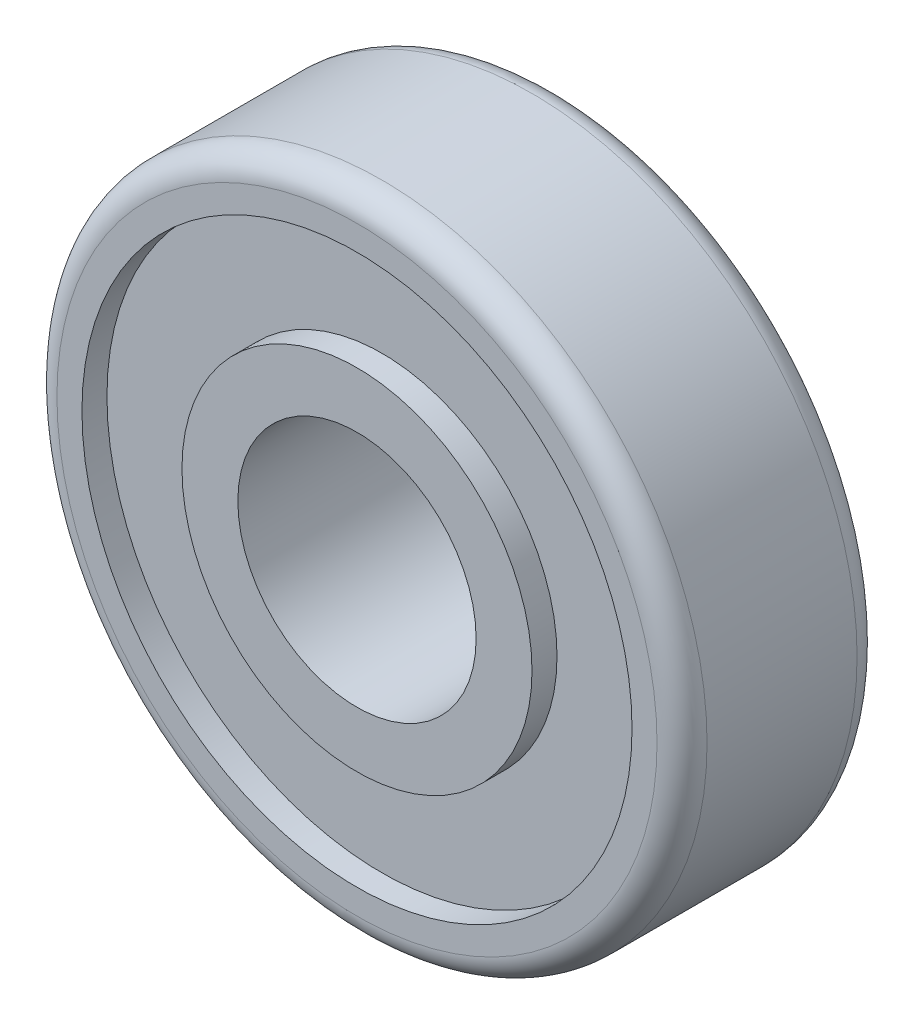
ISO-10303-21;
HEADER;
FILE_DESCRIPTION(('STEP AP214'),'2;1');
FILE_NAME('part.step','',(''),(''),'','','');
FILE_SCHEMA(('AUTOMOTIVE_DESIGN { 1 0 10303 214 1 1 1 1 }'));
ENDSEC;
DATA;
#1=APPLICATION_CONTEXT('core data for automotive mechanical design processes');
#2=APPLICATION_PROTOCOL_DEFINITION('international standard','automotive_design',2000,#1);
#3=PRODUCT_CONTEXT('',#1,'mechanical');
#4=PRODUCT('Part','Part','',(#3));
#5=PRODUCT_RELATED_PRODUCT_CATEGORY('part','',(#4));
#6=PRODUCT_DEFINITION_FORMATION('','',#4);
#7=PRODUCT_DEFINITION_CONTEXT('part definition',#1,'design');
#8=PRODUCT_DEFINITION('design','',#6,#7);
#9=PRODUCT_DEFINITION_SHAPE('','',#8);
#10=(LENGTH_UNIT() NAMED_UNIT(*) SI_UNIT(.MILLI.,.METRE.));
#11=(NAMED_UNIT(*) PLANE_ANGLE_UNIT() SI_UNIT($,.RADIAN.));
#12=(NAMED_UNIT(*) SI_UNIT($,.STERADIAN.) SOLID_ANGLE_UNIT());
#13=UNCERTAINTY_MEASURE_WITH_UNIT(LENGTH_MEASURE(1.E-05),#10,'distance_accuracy_value','');
#14=(GEOMETRIC_REPRESENTATION_CONTEXT(3) GLOBAL_UNCERTAINTY_ASSIGNED_CONTEXT((#13)) GLOBAL_UNIT_ASSIGNED_CONTEXT((#10,
#11,#12)) REPRESENTATION_CONTEXT('',''));
#15=CARTESIAN_POINT('',(0.,0.,0.));
#16=DIRECTION('',(0.,0.,1.));
#17=DIRECTION('',(1.,0.,0.));
#18=AXIS2_PLACEMENT_3D('',#15,#16,#17);
#19=CARTESIAN_POINT('',(0.,0.,0.));
#20=DIRECTION('',(0.,0.,1.));
#21=DIRECTION('',(1.,0.,0.));
#22=AXIS2_PLACEMENT_3D('',#19,#20,#21);
#23=PLANE('',#22);
#24=CARTESIAN_POINT('',(0.,0.,0.));
#25=DIRECTION('',(0.,0.,1.));
#26=DIRECTION('',(1.,0.,0.));
#27=AXIS2_PLACEMENT_3D('',#24,#25,#26);
#28=CIRCLE('',#27,4.765);
#29=CARTESIAN_POINT('',(4.765,0.,0.));
#30=VERTEX_POINT('',#29);
#31=EDGE_CURVE('E52',#30,#30,#28,.T.);
#32=ORIENTED_EDGE('',*,*,#31,.T.);
#33=EDGE_LOOP('',(#32));
#34=FACE_BOUND('',#33,.T.);
#35=CARTESIAN_POINT('',(0.,0.,0.));
#36=DIRECTION('',(0.,0.,-1.));
#37=DIRECTION('',(-1.,0.,0.));
#38=AXIS2_PLACEMENT_3D('',#35,#36,#37);
#39=CIRCLE('',#38,7.);
#40=CARTESIAN_POINT('',(-7.,0.,0.));
#41=VERTEX_POINT('',#40);
#42=EDGE_CURVE('E76',#41,#41,#39,.T.);
#43=ORIENTED_EDGE('',*,*,#42,.T.);
#44=EDGE_LOOP('',(#43));
#45=FACE_BOUND('',#44,.T.);
#46=ADVANCED_FACE('F31',(#34,#45),#23,.F.);
#47=CARTESIAN_POINT('',(0.,0.,8.));
#48=DIRECTION('',(0.,0.,1.));
#49=DIRECTION('',(1.,0.,0.));
#50=AXIS2_PLACEMENT_3D('',#47,#48,#49);
#51=PLANE('',#50);
#52=CARTESIAN_POINT('',(0.,0.,8.));
#53=DIRECTION('',(0.,0.,1.));
#54=DIRECTION('',(1.,0.,0.));
#55=AXIS2_PLACEMENT_3D('',#52,#53,#54);
#56=CIRCLE('',#55,4.765);
#57=CARTESIAN_POINT('',(4.765,0.,8.));
#58=VERTEX_POINT('',#57);
#59=EDGE_CURVE('E51',#58,#58,#56,.T.);
#60=ORIENTED_EDGE('',*,*,#59,.F.);
#61=EDGE_LOOP('',(#60));
#62=FACE_BOUND('',#61,.T.);
#63=CARTESIAN_POINT('',(0.,0.,8.));
#64=DIRECTION('',(0.,0.,1.));
#65=DIRECTION('',(1.,0.,0.));
#66=AXIS2_PLACEMENT_3D('',#63,#64,#65);
#67=CIRCLE('',#66,7.);
#68=CARTESIAN_POINT('',(7.,0.,8.));
#69=VERTEX_POINT('',#68);
#70=EDGE_CURVE('E64',#69,#69,#67,.T.);
#71=ORIENTED_EDGE('',*,*,#70,.T.);
#72=EDGE_LOOP('',(#71));
#73=FACE_BOUND('',#72,.T.);
#74=ADVANCED_FACE('F110',(#62,#73),#51,.T.);
#75=CARTESIAN_POINT('',(0.,0.,8.));
#76=DIRECTION('',(0.,0.,1.));
#77=DIRECTION('',(1.,0.,0.));
#78=AXIS2_PLACEMENT_3D('',#75,#76,#77);
#79=CIRCLE('',#78,12.);
#80=CARTESIAN_POINT('',(12.,0.,8.));
#81=VERTEX_POINT('',#80);
#82=EDGE_CURVE('E10',#81,#81,#79,.T.);
#83=ORIENTED_EDGE('',*,*,#82,.T.);
#84=EDGE_LOOP('',(#83));
#85=FACE_BOUND('',#84,.T.);
#86=CARTESIAN_POINT('',(0.,0.,8.));
#87=DIRECTION('',(0.,0.,1.));
#88=DIRECTION('',(1.,0.,0.));
#89=AXIS2_PLACEMENT_3D('',#86,#87,#88);
#90=CIRCLE('',#89,11.);
#91=CARTESIAN_POINT('',(11.,0.,8.));
#92=VERTEX_POINT('',#91);
#93=EDGE_CURVE('E58',#92,#92,#90,.T.);
#94=ORIENTED_EDGE('',*,*,#93,.F.);
#95=EDGE_LOOP('',(#94));
#96=FACE_BOUND('',#95,.T.);
#97=ADVANCED_FACE('F101',(#85,#96),#51,.T.);
#98=CARTESIAN_POINT('',(0.,0.,0.));
#99=DIRECTION('',(0.,0.,1.));
#100=DIRECTION('',(1.,0.,0.));
#101=AXIS2_PLACEMENT_3D('',#98,#99,#100);
#102=CIRCLE('',#101,12.);
#103=CARTESIAN_POINT('',(12.,0.,0.));
#104=VERTEX_POINT('',#103);
#105=EDGE_CURVE('E38',#104,#104,#102,.F.);
#106=ORIENTED_EDGE('',*,*,#105,.T.);
#107=EDGE_LOOP('',(#106));
#108=FACE_BOUND('',#107,.T.);
#109=CARTESIAN_POINT('',(0.,0.,0.));
#110=DIRECTION('',(0.,0.,-1.));
#111=DIRECTION('',(-1.,0.,0.));
#112=AXIS2_PLACEMENT_3D('',#109,#110,#111);
#113=CIRCLE('',#112,11.);
#114=CARTESIAN_POINT('',(-11.,0.,0.));
#115=VERTEX_POINT('',#114);
#116=EDGE_CURVE('E70',#115,#115,#113,.T.);
#117=ORIENTED_EDGE('',*,*,#116,.F.);
#118=EDGE_LOOP('',(#117));
#119=FACE_BOUND('',#118,.T.);
#120=ADVANCED_FACE('F98',(#108,#119),#23,.F.);
#121=CARTESIAN_POINT('',(0.,0.,8.));
#122=DIRECTION('',(0.,0.,-1.));
#123=DIRECTION('',(-1.,0.,0.));
#124=AXIS2_PLACEMENT_3D('',#121,#122,#123);
#125=CYLINDRICAL_SURFACE('',#124,13.);
#126=CARTESIAN_POINT('',(0.,0.,1.));
#127=DIRECTION('',(0.,0.,1.));
#128=DIRECTION('',(1.,0.,0.));
#129=AXIS2_PLACEMENT_3D('',#126,#127,#128);
#130=CIRCLE('',#129,13.);
#131=CARTESIAN_POINT('',(13.,0.,1.));
#132=VERTEX_POINT('',#131);
#133=EDGE_CURVE('E42',#132,#132,#130,.T.);
#134=ORIENTED_EDGE('',*,*,#133,.T.);
#135=EDGE_LOOP('',(#134));
#136=FACE_BOUND('',#135,.T.);
#137=CARTESIAN_POINT('',(0.,0.,7.));
#138=DIRECTION('',(0.,0.,1.));
#139=DIRECTION('',(1.,0.,0.));
#140=AXIS2_PLACEMENT_3D('',#137,#138,#139);
#141=CIRCLE('',#140,13.);
#142=CARTESIAN_POINT('',(13.,0.,7.));
#143=VERTEX_POINT('',#142);
#144=EDGE_CURVE('E46',#143,#143,#141,.F.);
#145=ORIENTED_EDGE('',*,*,#144,.T.);
#146=EDGE_LOOP('',(#145));
#147=FACE_BOUND('',#146,.T.);
#148=ADVANCED_FACE('F100',(#136,#147),#125,.T.);
#149=CARTESIAN_POINT('',(0.,0.,8.));
#150=DIRECTION('',(0.,0.,-1.));
#151=DIRECTION('',(-1.,0.,0.));
#152=AXIS2_PLACEMENT_3D('',#149,#150,#151);
#153=CYLINDRICAL_SURFACE('',#152,4.765);
#154=ORIENTED_EDGE('',*,*,#59,.T.);
#155=EDGE_LOOP('',(#154));
#156=FACE_BOUND('',#155,.T.);
#157=ORIENTED_EDGE('',*,*,#31,.F.);
#158=EDGE_LOOP('',(#157));
#159=FACE_BOUND('',#158,.T.);
#160=ADVANCED_FACE('F107',(#156,#159),#153,.F.);
#161=CARTESIAN_POINT('',(0.,0.,7.));
#162=DIRECTION('',(0.,0.,1.));
#163=DIRECTION('',(1.,0.,0.));
#164=AXIS2_PLACEMENT_3D('',#161,#162,#163);
#165=CYLINDRICAL_SURFACE('',#164,11.);
#166=CARTESIAN_POINT('',(0.,0.,7.));
#167=DIRECTION('',(0.,0.,1.));
#168=DIRECTION('',(1.,0.,0.));
#169=AXIS2_PLACEMENT_3D('',#166,#167,#168);
#170=CIRCLE('',#169,11.);
#171=CARTESIAN_POINT('',(11.,0.,7.));
#172=VERTEX_POINT('',#171);
#173=EDGE_CURVE('E55',#172,#172,#170,.T.);
#174=ORIENTED_EDGE('',*,*,#173,.F.);
#175=EDGE_LOOP('',(#174));
#176=FACE_BOUND('',#175,.T.);
#177=ORIENTED_EDGE('',*,*,#93,.T.);
#178=EDGE_LOOP('',(#177));
#179=FACE_BOUND('',#178,.T.);
#180=ADVANCED_FACE('F135',(#176,#179),#165,.F.);
#181=CARTESIAN_POINT('',(0.,0.,7.));
#182=DIRECTION('',(0.,0.,1.));
#183=DIRECTION('',(1.,0.,0.));
#184=AXIS2_PLACEMENT_3D('',#181,#182,#183);
#185=PLANE('',#184);
#186=CARTESIAN_POINT('',(0.,0.,7.));
#187=DIRECTION('',(0.,0.,1.));
#188=DIRECTION('',(1.,0.,0.));
#189=AXIS2_PLACEMENT_3D('',#186,#187,#188);
#190=CIRCLE('',#189,7.);
#191=CARTESIAN_POINT('',(7.,0.,7.));
#192=VERTEX_POINT('',#191);
#193=EDGE_CURVE('E61',#192,#192,#190,.T.);
#194=ORIENTED_EDGE('',*,*,#193,.F.);
#195=EDGE_LOOP('',(#194));
#196=FACE_BOUND('',#195,.T.);
#197=ORIENTED_EDGE('',*,*,#173,.T.);
#198=EDGE_LOOP('',(#197));
#199=FACE_BOUND('',#198,.T.);
#200=ADVANCED_FACE('F131',(#196,#199),#185,.T.);
#201=CARTESIAN_POINT('',(0.,0.,7.));
#202=DIRECTION('',(0.,0.,1.));
#203=DIRECTION('',(1.,0.,0.));
#204=AXIS2_PLACEMENT_3D('',#201,#202,#203);
#205=CYLINDRICAL_SURFACE('',#204,7.);
#206=ORIENTED_EDGE('',*,*,#193,.T.);
#207=EDGE_LOOP('',(#206));
#208=FACE_BOUND('',#207,.T.);
#209=ORIENTED_EDGE('',*,*,#70,.F.);
#210=EDGE_LOOP('',(#209));
#211=FACE_BOUND('',#210,.T.);
#212=ADVANCED_FACE('F94',(#208,#211),#205,.T.);
#213=CARTESIAN_POINT('',(0.,0.,1.));
#214=DIRECTION('',(0.,0.,-1.));
#215=DIRECTION('',(-1.,0.,0.));
#216=AXIS2_PLACEMENT_3D('',#213,#214,#215);
#217=CYLINDRICAL_SURFACE('',#216,11.);
#218=CARTESIAN_POINT('',(0.,0.,1.));
#219=DIRECTION('',(0.,0.,-1.));
#220=DIRECTION('',(-1.,0.,0.));
#221=AXIS2_PLACEMENT_3D('',#218,#219,#220);
#222=CIRCLE('',#221,11.);
#223=CARTESIAN_POINT('',(-11.,0.,1.));
#224=VERTEX_POINT('',#223);
#225=EDGE_CURVE('E67',#224,#224,#222,.T.);
#226=ORIENTED_EDGE('',*,*,#225,.F.);
#227=EDGE_LOOP('',(#226));
#228=FACE_BOUND('',#227,.T.);
#229=ORIENTED_EDGE('',*,*,#116,.T.);
#230=EDGE_LOOP('',(#229));
#231=FACE_BOUND('',#230,.T.);
#232=ADVANCED_FACE('F88',(#228,#231),#217,.F.);
#233=CARTESIAN_POINT('',(0.,0.,1.));
#234=DIRECTION('',(0.,0.,-1.));
#235=DIRECTION('',(-1.,0.,0.));
#236=AXIS2_PLACEMENT_3D('',#233,#234,#235);
#237=PLANE('',#236);
#238=CARTESIAN_POINT('',(0.,0.,1.));
#239=DIRECTION('',(0.,0.,-1.));
#240=DIRECTION('',(-1.,0.,0.));
#241=AXIS2_PLACEMENT_3D('',#238,#239,#240);
#242=CIRCLE('',#241,7.);
#243=CARTESIAN_POINT('',(-7.,0.,1.));
#244=VERTEX_POINT('',#243);
#245=EDGE_CURVE('E73',#244,#244,#242,.T.);
#246=ORIENTED_EDGE('',*,*,#245,.F.);
#247=EDGE_LOOP('',(#246));
#248=FACE_BOUND('',#247,.T.);
#249=ORIENTED_EDGE('',*,*,#225,.T.);
#250=EDGE_LOOP('',(#249));
#251=FACE_BOUND('',#250,.T.);
#252=ADVANCED_FACE('F85',(#248,#251),#237,.T.);
#253=CARTESIAN_POINT('',(0.,0.,1.));
#254=DIRECTION('',(0.,0.,-1.));
#255=DIRECTION('',(-1.,0.,0.));
#256=AXIS2_PLACEMENT_3D('',#253,#254,#255);
#257=CYLINDRICAL_SURFACE('',#256,7.);
#258=ORIENTED_EDGE('',*,*,#245,.T.);
#259=EDGE_LOOP('',(#258));
#260=FACE_BOUND('',#259,.T.);
#261=ORIENTED_EDGE('',*,*,#42,.F.);
#262=EDGE_LOOP('',(#261));
#263=FACE_BOUND('',#262,.T.);
#264=ADVANCED_FACE('F82',(#260,#263),#257,.T.);
#265=CARTESIAN_POINT('',(0.,0.,1.));
#266=DIRECTION('',(0.,0.,1.));
#267=DIRECTION('',(1.,0.,0.));
#268=AXIS2_PLACEMENT_3D('',#265,#266,#267);
#269=TOROIDAL_SURFACE('',#268,12.,1.);
#270=ORIENTED_EDGE('',*,*,#105,.F.);
#271=EDGE_LOOP('',(#270));
#272=FACE_BOUND('',#271,.T.);
#273=ORIENTED_EDGE('',*,*,#133,.F.);
#274=EDGE_LOOP('',(#273));
#275=FACE_BOUND('',#274,.T.);
#276=ADVANCED_FACE('F122',(#272,#275),#269,.T.);
#277=CARTESIAN_POINT('',(0.,0.,7.));
#278=DIRECTION('',(0.,0.,1.));
#279=DIRECTION('',(1.,0.,0.));
#280=AXIS2_PLACEMENT_3D('',#277,#278,#279);
#281=TOROIDAL_SURFACE('',#280,12.,1.);
#282=ORIENTED_EDGE('',*,*,#144,.F.);
#283=EDGE_LOOP('',(#282));
#284=FACE_BOUND('',#283,.T.);
#285=ORIENTED_EDGE('',*,*,#82,.F.);
#286=EDGE_LOOP('',(#285));
#287=FACE_BOUND('',#286,.T.);
#288=ADVANCED_FACE('F33',(#284,#287),#281,.T.);
#289=CLOSED_SHELL('',(#46,#74,#97,#120,#148,#160,#180,#200,#212,#232,#252,#264,#276,#288));
#290=MANIFOLD_SOLID_BREP('B2',#289);
#291=ADVANCED_BREP_SHAPE_REPRESENTATION('',(#18,#290),#14);
#292=SHAPE_DEFINITION_REPRESENTATION(#9,#291);
ENDSEC;
END-ISO-10303-21;
